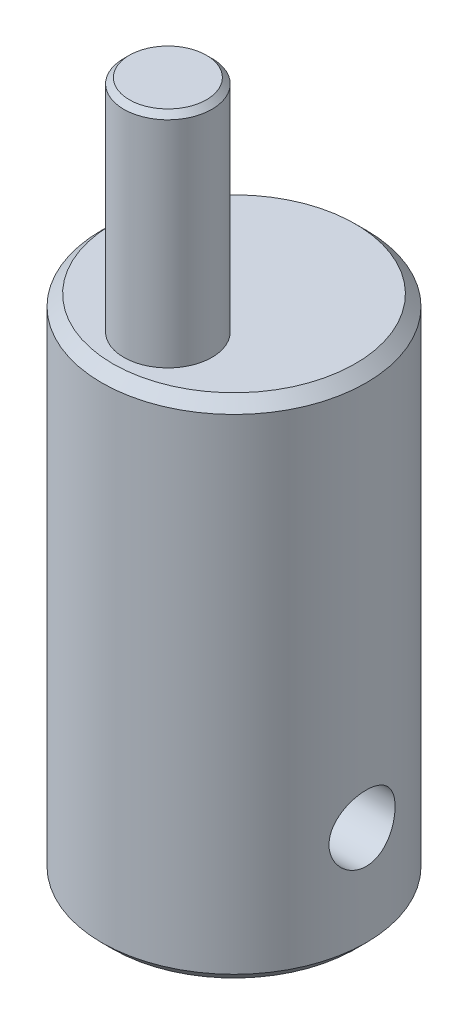
ISO-10303-21;
HEADER;
FILE_DESCRIPTION(('STEP AP214'),'2;1');
FILE_NAME('part.step','',(''),(''),'','','');
FILE_SCHEMA(('AUTOMOTIVE_DESIGN { 1 0 10303 214 1 1 1 1 }'));
ENDSEC;
DATA;
#1=APPLICATION_CONTEXT('core data for automotive mechanical design processes');
#2=APPLICATION_PROTOCOL_DEFINITION('international standard','automotive_design',2000,#1);
#3=PRODUCT_CONTEXT('',#1,'mechanical');
#4=PRODUCT('Part','Part','',(#3));
#5=PRODUCT_RELATED_PRODUCT_CATEGORY('part','',(#4));
#6=PRODUCT_DEFINITION_FORMATION('','',#4);
#7=PRODUCT_DEFINITION_CONTEXT('part definition',#1,'design');
#8=PRODUCT_DEFINITION('design','',#6,#7);
#9=PRODUCT_DEFINITION_SHAPE('','',#8);
#10=(LENGTH_UNIT() NAMED_UNIT(*) SI_UNIT(.MILLI.,.METRE.));
#11=(NAMED_UNIT(*) PLANE_ANGLE_UNIT() SI_UNIT($,.RADIAN.));
#12=(NAMED_UNIT(*) SI_UNIT($,.STERADIAN.) SOLID_ANGLE_UNIT());
#13=UNCERTAINTY_MEASURE_WITH_UNIT(LENGTH_MEASURE(1.E-05),#10,'distance_accuracy_value','');
#14=(GEOMETRIC_REPRESENTATION_CONTEXT(3) GLOBAL_UNCERTAINTY_ASSIGNED_CONTEXT((#13)) GLOBAL_UNIT_ASSIGNED_CONTEXT((#10,
#11,#12)) REPRESENTATION_CONTEXT('',''));
#15=CARTESIAN_POINT('',(0.,0.,0.));
#16=DIRECTION('',(0.,0.,1.));
#17=DIRECTION('',(1.,0.,0.));
#18=AXIS2_PLACEMENT_3D('',#15,#16,#17);
#19=CARTESIAN_POINT('',(0.,23.,0.));
#20=DIRECTION('',(0.,-1.,0.));
#21=DIRECTION('',(0.,0.,-1.));
#22=AXIS2_PLACEMENT_3D('',#19,#20,#21);
#23=CYLINDRICAL_SURFACE('',#22,6.);
#24=CARTESIAN_POINT('',(0.,0.499999999999994,0.));
#25=DIRECTION('',(0.,1.,0.));
#26=DIRECTION('',(0.,0.,1.));
#27=AXIS2_PLACEMENT_3D('',#24,#25,#26);
#28=CIRCLE('',#27,6.);
#29=CARTESIAN_POINT('',(0.,0.499999999999994,6.));
#30=VERTEX_POINT('',#29);
#31=EDGE_CURVE('E44',#30,#30,#28,.T.);
#32=ORIENTED_EDGE('',*,*,#31,.T.);
#33=EDGE_LOOP('',(#32));
#34=FACE_BOUND('',#33,.T.);
#35=CARTESIAN_POINT('',(0.,22.5,0.));
#36=DIRECTION('',(0.,1.,0.));
#37=DIRECTION('',(0.,0.,1.));
#38=AXIS2_PLACEMENT_3D('',#35,#36,#37);
#39=CIRCLE('',#38,6.);
#40=CARTESIAN_POINT('',(0.,22.5,6.));
#41=VERTEX_POINT('',#40);
#42=EDGE_CURVE('E48',#41,#41,#39,.F.);
#43=ORIENTED_EDGE('',*,*,#42,.T.);
#44=EDGE_LOOP('',(#43));
#45=FACE_BOUND('',#44,.T.);
#46=CARTESIAN_POINT('',(-6.,3.5,0.));
#47=CARTESIAN_POINT('',(-5.99999859868013,3.50000232573816,-0.0828760886697311));
#48=CARTESIAN_POINT('',(-5.99826578131828,3.50689155077379,-0.165778157830763));
#49=CARTESIAN_POINT('',(-5.99152113829892,3.534225151307,-0.329206323770533));
#50=CARTESIAN_POINT('',(-5.98650745419968,3.55467720953785,-0.409731046870739));
#51=CARTESIAN_POINT('',(-5.9737562633204,3.60843925346209,-0.566020872182577));
#52=CARTESIAN_POINT('',(-5.96602202842087,3.64173379871528,-0.641791563430003));
#53=CARTESIAN_POINT('',(-5.94865343807593,3.72018139004483,-0.786672131904427));
#54=CARTESIAN_POINT('',(-5.9390190185405,3.76533483611894,-0.855781784348759));
#55=CARTESIAN_POINT('',(-5.91867413591801,3.86720078965421,-0.98680192730092));
#56=CARTESIAN_POINT('',(-5.90794707148533,3.92411157495918,-1.04855569006107));
#57=CARTESIAN_POINT('',(-5.88673620117529,4.04745220490892,-1.1617489272033));
#58=CARTESIAN_POINT('',(-5.87625242288348,4.1138831229465,-1.21318723694913));
#59=CARTESIAN_POINT('',(-5.8565477569971,4.25559522673744,-1.30502654279903));
#60=CARTESIAN_POINT('',(-5.84734794470605,4.3309932308104,-1.34525221592536));
#61=CARTESIAN_POINT('',(-5.83149494812223,4.48774841165836,-1.41239690855053));
#62=CARTESIAN_POINT('',(-5.82484135672789,4.56910463332576,-1.43931805543933));
#63=CARTESIAN_POINT('',(-5.81500476717551,4.73374349820247,-1.47855483680429));
#64=CARTESIAN_POINT('',(-5.81175491075426,4.8169548960498,-1.49115226833334));
#65=CARTESIAN_POINT('',(-5.80889362537741,4.98436856901398,-1.50226177506785));
#66=CARTESIAN_POINT('',(-5.80928160448644,5.06857068069861,-1.50077614181798));
#67=CARTESIAN_POINT('',(-5.81359205496618,5.23341580774448,-1.48398652463928));
#68=CARTESIAN_POINT('',(-5.81742863001879,5.3140956214651,-1.46901834019052));
#69=CARTESIAN_POINT('',(-5.82806709676483,5.47176105091129,-1.42622418690311));
#70=CARTESIAN_POINT('',(-5.83486919970696,5.54874640302898,-1.39839730206942));
#71=CARTESIAN_POINT('',(-5.85075113904186,5.69773801625207,-1.33038947793715));
#72=CARTESIAN_POINT('',(-5.85985327469421,5.76968617178955,-1.29008666723291));
#73=CARTESIAN_POINT('',(-5.87929710846386,5.90591870975684,-1.19835627601495));
#74=CARTESIAN_POINT('',(-5.88963902334735,5.97020174806726,-1.14692674880884));
#75=CARTESIAN_POINT('',(-5.91075880539781,6.0912036156944,-1.03266342468122));
#76=CARTESIAN_POINT('',(-5.92154069477971,6.14765449006135,-0.96954625816586));
#77=CARTESIAN_POINT('',(-5.94205965578786,6.2492212424639,-0.8346119175037));
#78=CARTESIAN_POINT('',(-5.95179669549415,6.29433677426357,-0.762794477707944));
#79=CARTESIAN_POINT('',(-5.96917732094182,6.37205058622439,-0.612115888681392));
#80=CARTESIAN_POINT('',(-5.97681360127725,6.40460534025443,-0.533231393208624));
#81=CARTESIAN_POINT('',(-5.98907916991418,6.45591730570957,-0.370876008142883));
#82=CARTESIAN_POINT('',(-5.99370903339281,6.47467715641814,-0.287405999150485));
#83=CARTESIAN_POINT('',(-5.99935499271374,6.49745756555884,-0.120539970390027));
#84=CARTESIAN_POINT('',(-6.00046053508279,6.5018430260753,-0.0371967199882104));
#85=CARTESIAN_POINT('',(-5.99918804814451,6.49675099794451,0.129032874801507));
#86=CARTESIAN_POINT('',(-5.99681033241846,6.48727475720087,0.211919259644594));
#87=CARTESIAN_POINT('',(-5.98889581127357,6.45502909160862,0.373614268776491));
#88=CARTESIAN_POINT('',(-5.98340634185811,6.43245873652301,0.452465118968754));
#89=CARTESIAN_POINT('',(-5.96988706634134,6.37489291597155,0.605257292452511));
#90=CARTESIAN_POINT('',(-5.96185700369892,6.33989619568683,0.679198119032634));
#91=CARTESIAN_POINT('',(-5.9439330792631,6.25776387112527,0.821523134429847));
#92=CARTESIAN_POINT('',(-5.93400867366932,6.21042388760324,0.88978544183583));
#93=CARTESIAN_POINT('',(-5.91344509187419,6.10521009120303,1.01752661364325));
#94=CARTESIAN_POINT('',(-5.90280579251705,6.04733446038309,1.07700395897301));
#95=CARTESIAN_POINT('',(-5.88168956960771,5.92099803915554,1.18699056807273));
#96=CARTESIAN_POINT('',(-5.87122304187281,5.85231229699758,1.23724386762203));
#97=CARTESIAN_POINT('',(-5.85192878377239,5.70726736553428,1.3255107590127));
#98=CARTESIAN_POINT('',(-5.84310098067026,5.63090851704025,1.36352489415794));
#99=CARTESIAN_POINT('',(-5.82818094734665,5.47309427758692,1.42595142060929));
#100=CARTESIAN_POINT('',(-5.82207255291905,5.39167237165599,1.45044439665406));
#101=CARTESIAN_POINT('',(-5.81326744090183,5.22569036211089,1.48534565995378));
#102=CARTESIAN_POINT('',(-5.81056997719936,5.14113094896751,1.49575702747866));
#103=CARTESIAN_POINT('',(-5.80894901203957,4.9738789761448,1.50203859033399));
#104=CARTESIAN_POINT('',(-5.80991932728264,4.89120256487527,1.49831789778012));
#105=CARTESIAN_POINT('',(-5.81527909007843,4.72769611133202,1.47737727831287));
#106=CARTESIAN_POINT('',(-5.81966846891857,4.64686603198635,1.46015762268677));
#107=CARTESIAN_POINT('',(-5.83131260682722,4.48979154093459,1.41293131944279));
#108=CARTESIAN_POINT('',(-5.83855015236309,4.41352269475979,1.38300140468038));
#109=CARTESIAN_POINT('',(-5.85507755724828,4.26703461728631,1.31126491360507));
#110=CARTESIAN_POINT('',(-5.86436770120773,4.19681622681309,1.26945669003419));
#111=CARTESIAN_POINT('',(-5.88425634263512,4.06244537099798,1.17386774863714));
#112=CARTESIAN_POINT('',(-5.89488264831757,3.99849892657604,1.11980316291226));
#113=CARTESIAN_POINT('',(-5.91608027246286,3.88045295520459,1.00178937118974));
#114=CARTESIAN_POINT('',(-5.92665157727059,3.82635576988703,0.937837821261146));
#115=CARTESIAN_POINT('',(-5.94677655647663,3.72858869143539,0.800467586702591));
#116=CARTESIAN_POINT('',(-5.95630833365868,3.68512538632842,0.726898422316388));
#117=CARTESIAN_POINT('',(-5.97304924975118,3.61125253705947,0.573266059510477));
#118=CARTESIAN_POINT('',(-5.98026005199781,3.58083363935146,0.49320756343674));
#119=CARTESIAN_POINT('',(-5.99048059565541,3.53842816967035,0.344410253243472));
#120=CARTESIAN_POINT('',(-5.9940258505269,3.52404875694657,0.276380170908069));
#121=CARTESIAN_POINT('',(-5.99878605231948,3.50483405637806,0.138906071536283));
#122=CARTESIAN_POINT('',(-6.00000117450894,3.4999980506947,0.0694621612426164));
#123=CARTESIAN_POINT('',(-6.,3.5,0.));
#124=B_SPLINE_CURVE_WITH_KNOTS('',3,(#46,#47,#48,#49,#50,#51,#52,#53,#54,#55,#56,#57,#58,#59,
#60,#61,#62,#63,#64,#65,#66,#67,#68,#69,#70,#71,#72,#73,#74,#75,#76,#77,#78,#79,#80,#81,#82,#83,
#84,#85,#86,#87,#88,#89,#90,#91,#92,#93,#94,#95,#96,#97,#98,#99,#100,#101,#102,#103,#104,#105,
#106,#107,#108,#109,#110,#111,#112,#113,#114,#115,#116,#117,#118,#119,#120,#121,#122,#123),
.UNSPECIFIED.,.T.,.F.,(4,2,2,2,2,2,2,2,2,2,2,2,2,2,2,2,2,2,2,2,2,2,2,2,2,2,2,2,2,2,2,2,2,2,2,2,
2,2,4),(0.,0.24837371247189,0.4968882377639,0.745104902286106,0.993329940169329,
1.24614435437139,1.49898729580062,1.75558647545807,2.01214461169368,2.2635629509943,
2.51494038112697,2.76022497007018,3.00552703466038,3.25330527873879,3.50112690836163,
3.75601500969019,4.01091089558247,4.26668229009114,4.52240473688643,4.77158308949276,
5.02073901112743,5.26620274514037,5.5116912732229,5.76153587565352,6.01142363008019,
6.26744509204476,6.52345518749508,6.77792254614036,7.03233423252407,7.27943780398612,
7.52653640956034,7.77216400559447,8.01782568136901,8.2698957640991,8.52202569770417,
8.77872185499588,9.0352336382135,9.24342242942149,9.45159556043039),.UNSPECIFIED.);
#125=CARTESIAN_POINT('',(-6.,3.5,0.));
#126=VERTEX_POINT('',#125);
#127=EDGE_CURVE('E59',#126,#126,#124,.T.);
#128=ORIENTED_EDGE('',*,*,#127,.T.);
#129=EDGE_LOOP('',(#128));
#130=FACE_BOUND('',#129,.T.);
#131=CARTESIAN_POINT('',(5.80947501931112,5.,-1.5));
#132=CARTESIAN_POINT('',(5.80947660051185,4.91716954944523,-1.49999764715507));
#133=CARTESIAN_POINT('',(5.81126583608348,4.8343130607932,-1.49311574729838));
#134=CARTESIAN_POINT('',(5.81821117195949,4.67097945309558,-1.46581387527848));
#135=CARTESIAN_POINT('',(5.82336923173088,4.590503747319,-1.44538602404532));
#136=CARTESIAN_POINT('',(5.8364323475758,4.43431787708778,-1.39169471977917));
#137=CARTESIAN_POINT('',(5.84433385614245,4.3586017067686,-1.35844783671268));
#138=CARTESIAN_POINT('',(5.86198915217285,4.21381348847605,-1.28011268475685));
#139=CARTESIAN_POINT('',(5.87174301827101,4.14474172275186,-1.23502391313642));
#140=CARTESIAN_POINT('',(5.89224429813367,4.01368301284268,-1.13322505638712));
#141=CARTESIAN_POINT('',(5.90300758573818,3.95186383978997,-1.07630213262243));
#142=CARTESIAN_POINT('',(5.92417725309178,3.83854316338379,-0.952909238460398));
#143=CARTESIAN_POINT('',(5.93458359939834,3.78704262462695,-0.886438376508184));
#144=CARTESIAN_POINT('',(5.95404249312349,3.69513471942123,-0.744687120647372));
#145=CARTESIAN_POINT('',(5.96307412440355,3.65489216710312,-0.669296745717072));
#146=CARTESIAN_POINT('',(5.9785848715559,3.58771421350815,-0.512557910575657));
#147=CARTESIAN_POINT('',(5.98506436400607,3.56077684885069,-0.431210331475164));
#148=CARTESIAN_POINT('',(5.99462855308908,3.52151129925285,-0.266615255252496));
#149=CARTESIAN_POINT('',(5.99777936306588,3.50889821340405,-0.183439631729385));
#150=CARTESIAN_POINT('',(6.00056156464379,3.49774497243467,-0.016097291557661));
#151=CARTESIAN_POINT('',(6.00019347658022,3.49920273667424,0.0680692767228418));
#152=CARTESIAN_POINT('',(5.99602856972121,3.51594491015009,0.233028370758582));
#153=CARTESIAN_POINT('',(5.99230801404524,3.53092179503231,0.313854323401601));
#154=CARTESIAN_POINT('',(5.98194501914912,3.5737827620291,0.47180737112053));
#155=CARTESIAN_POINT('',(5.97530242439064,3.60166753122645,0.548934269055657));
#156=CARTESIAN_POINT('',(5.95972505820537,3.66980154241224,0.698110055252711));
#157=CARTESIAN_POINT('',(5.95077011817032,3.71016022679705,0.770106764649757));
#158=CARTESIAN_POINT('',(5.93153942285789,3.80201340746976,0.906413433510734));
#159=CARTESIAN_POINT('',(5.92126343791494,3.85350984113637,0.970722052628259));
#160=CARTESIAN_POINT('',(5.90018228261712,3.96782524518943,1.09166105262743));
#161=CARTESIAN_POINT('',(5.88937031715551,4.03091293540867,1.1480365186128));
#162=CARTESIAN_POINT('',(5.86869026110024,4.16575998412415,1.24946456394453));
#163=CARTESIAN_POINT('',(5.85882221463582,4.2375197476946,1.29451661406903));
#164=CARTESIAN_POINT('',(5.84112298098989,4.38817402048938,1.3721821935339));
#165=CARTESIAN_POINT('',(5.83330190235432,4.46710143818792,1.40473435045574));
#166=CARTESIAN_POINT('',(5.82071184083974,4.62955128084587,1.45602843095451));
#167=CARTESIAN_POINT('',(5.81594220486131,4.71307271838988,1.47477330982937));
#168=CARTESIAN_POINT('',(5.81013213623484,4.87997570091387,1.49749778319911));
#169=CARTESIAN_POINT('',(5.80899653456189,4.96330267599778,1.50185428435178));
#170=CARTESIAN_POINT('',(5.81032406088624,5.1294931619469,1.49671019430933));
#171=CARTESIAN_POINT('',(5.8127868576076,5.21235671477075,1.48721087870928));
#172=CARTESIAN_POINT('',(5.82094249172736,5.37386855897283,1.4549552783626));
#173=CARTESIAN_POINT('',(5.82658182140625,5.45256363594251,1.43241844096905));
#174=CARTESIAN_POINT('',(5.84040430962577,5.60505887471101,1.37497084900237));
#175=CARTESIAN_POINT('',(5.84858776949168,5.6788584554332,1.34005862862753));
#176=CARTESIAN_POINT('',(5.86677682255957,5.82106476672041,1.25806240076193));
#177=CARTESIAN_POINT('',(5.87681501163985,5.88933730402586,1.21075305230138));
#178=CARTESIAN_POINT('',(5.89750249843029,6.01711301768081,1.10559043940168));
#179=CARTESIAN_POINT('',(5.90815189637082,6.07661474999005,1.04773544220816));
#180=CARTESIAN_POINT('',(5.92918441818964,6.18668662554257,0.921394081477088));
#181=CARTESIAN_POINT('',(5.93955421237101,6.23699603752929,0.852677928797388));
#182=CARTESIAN_POINT('',(5.9585832996824,6.32536152017075,0.707554024042012));
#183=CARTESIAN_POINT('',(5.96724268202376,6.36341822996492,0.631146673436386));
#184=CARTESIAN_POINT('',(5.98182069442988,6.42586762071676,0.473337302596635));
#185=CARTESIAN_POINT('',(5.98775898013446,6.45035857062744,0.391976071541821));
#186=CARTESIAN_POINT('',(5.99631176037473,6.48527620076505,0.226124640478211));
#187=CARTESIAN_POINT('',(5.99892689636045,6.49570559524343,0.141635047561864));
#188=CARTESIAN_POINT('',(6.00051254113217,6.5020513843633,-0.0256252896649907));
#189=CARTESIAN_POINT('',(5.99957968320012,6.49835256364309,-0.108380740449051));
#190=CARTESIAN_POINT('',(5.99438844686135,6.4774282590585,-0.27205124462211));
#191=CARTESIAN_POINT('',(5.99013016735643,6.46020317748035,-0.352966352671331));
#192=CARTESIAN_POINT('',(5.97878149280944,6.41292167034361,-0.510256553467225));
#193=CARTESIAN_POINT('',(5.97170646753999,6.38293482002806,-0.586653741871529));
#194=CARTESIAN_POINT('',(5.95546933370076,6.31104413147101,-0.733375579562203));
#195=CARTESIAN_POINT('',(5.94630696206604,6.26913879099565,-0.803699461897578));
#196=CARTESIAN_POINT('',(5.92660874521999,6.17342714900439,-0.93810289263585));
#197=CARTESIAN_POINT('',(5.91604525418417,6.11935978563893,-1.00199248245088));
#198=CARTESIAN_POINT('',(5.89485973579863,6.0013657220393,-1.11992253040688));
#199=CARTESIAN_POINT('',(5.88423769428834,5.93743652585314,-1.17396048760228));
#200=CARTESIAN_POINT('',(5.86391213790822,5.800097878698,-1.27164303971884));
#201=CARTESIAN_POINT('',(5.85422945594827,5.72653381488106,-1.31507492916982));
#202=CARTESIAN_POINT('',(5.83715933325923,5.57291676511595,-1.3888903449235));
#203=CARTESIAN_POINT('',(5.82977022370054,5.49286855083989,-1.41928336463958));
#204=CARTESIAN_POINT('',(5.81927863109675,5.34413448225992,-1.46163379284816));
#205=CARTESIAN_POINT('',(5.8156299450082,5.27616025342421,-1.47598975589307));
#206=CARTESIAN_POINT('',(5.81072757878358,5.13879669650005,-1.4951734388599));
#207=CARTESIAN_POINT('',(5.80947369434945,5.06940748963241,-1.50000197155828));
#208=CARTESIAN_POINT('',(5.80947501931112,5.,-1.5));
#209=B_SPLINE_CURVE_WITH_KNOTS('',3,(#131,#132,#133,#134,#135,#136,#137,#138,#139,#140,#141,
#142,#143,#144,#145,#146,#147,#148,#149,#150,#151,#152,#153,#154,#155,#156,#157,#158,#159,#160,
#161,#162,#163,#164,#165,#166,#167,#168,#169,#170,#171,#172,#173,#174,#175,#176,#177,#178,#179,
#180,#181,#182,#183,#184,#185,#186,#187,#188,#189,#190,#191,#192,#193,#194,#195,#196,#197,#198,
#199,#200,#201,#202,#203,#204,#205,#206,#207,#208),.UNSPECIFIED.,.T.,.F.,(4,2,2,2,2,2,2,2,2,2,2,
2,2,2,2,2,2,2,2,2,2,2,2,2,2,2,2,2,2,2,2,2,2,2,2,2,2,2,4),(0.,0.248236465041681,0.4966174448572,
0.744678436299613,0.992749960532871,1.24574372515786,1.4987611288792,1.75530897838752,
2.01181895908255,2.26313250597208,2.51440889199612,2.76010957613368,3.00582334034872,
3.25375724552667,3.50173431281348,3.75642279943147,4.01112318719881,4.26705859205042,
4.52293920077729,4.7720614485703,5.02116076310281,5.26618443005524,5.51123712852851,
5.76109707515495,6.01099811331027,6.26715198579191,6.52329249431732,6.77755243684158,
7.03176329345423,7.27910067676474,7.52643070426189,7.77242925935826,8.01845883442843,
8.27038257949243,8.52237018939305,8.77905886370806,9.03556032819972,9.24358696306398,
9.45159585059712),.UNSPECIFIED.);
#210=CARTESIAN_POINT('',(5.80947501931112,5.,-1.5));
#211=VERTEX_POINT('',#210);
#212=EDGE_CURVE('E67',#211,#211,#209,.T.);
#213=ORIENTED_EDGE('',*,*,#212,.T.);
#214=EDGE_LOOP('',(#213));
#215=FACE_BOUND('',#214,.T.);
#216=ADVANCED_FACE('F32',(#34,#45,#130,#215),#23,.T.);
#217=CARTESIAN_POINT('',(0.,23.,0.));
#218=DIRECTION('',(0.,1.,0.));
#219=DIRECTION('',(0.,0.,1.));
#220=AXIS2_PLACEMENT_3D('',#217,#218,#219);
#221=PLANE('',#220);
#222=CARTESIAN_POINT('',(0.,23.,0.));
#223=DIRECTION('',(0.,1.,0.));
#224=DIRECTION('',(0.,0.,1.));
#225=AXIS2_PLACEMENT_3D('',#222,#223,#224);
#226=CIRCLE('',#225,5.50000000000001);
#227=CARTESIAN_POINT('',(0.,23.,5.50000000000001));
#228=VERTEX_POINT('',#227);
#229=EDGE_CURVE('E10',#228,#228,#226,.T.);
#230=ORIENTED_EDGE('',*,*,#229,.T.);
#231=EDGE_LOOP('',(#230));
#232=FACE_BOUND('',#231,.T.);
#233=CARTESIAN_POINT('',(0.,23.,3.));
#234=DIRECTION('',(0.,1.,0.));
#235=DIRECTION('',(0.,0.,1.));
#236=AXIS2_PLACEMENT_3D('',#233,#234,#235);
#237=CIRCLE('',#236,2.);
#238=CARTESIAN_POINT('',(0.,23.,5.));
#239=VERTEX_POINT('',#238);
#240=EDGE_CURVE('E108',#239,#239,#237,.T.);
#241=ORIENTED_EDGE('',*,*,#240,.F.);
#242=EDGE_LOOP('',(#241));
#243=FACE_BOUND('',#242,.T.);
#244=ADVANCED_FACE('F91',(#232,#243),#221,.T.);
#245=CARTESIAN_POINT('',(0.,0.,0.));
#246=DIRECTION('',(0.,1.,0.));
#247=DIRECTION('',(0.,0.,1.));
#248=AXIS2_PLACEMENT_3D('',#245,#246,#247);
#249=PLANE('',#248);
#250=CARTESIAN_POINT('',(0.,0.,0.));
#251=DIRECTION('',(0.,1.,0.));
#252=DIRECTION('',(0.,0.,1.));
#253=AXIS2_PLACEMENT_3D('',#250,#251,#252);
#254=CIRCLE('',#253,5.5);
#255=CARTESIAN_POINT('',(0.,0.,5.5));
#256=VERTEX_POINT('',#255);
#257=EDGE_CURVE('E40',#256,#256,#254,.F.);
#258=ORIENTED_EDGE('',*,*,#257,.T.);
#259=EDGE_LOOP('',(#258));
#260=FACE_BOUND('',#259,.T.);
#261=ADVANCED_FACE('F89',(#260),#249,.F.);
#262=CARTESIAN_POINT('',(0.,33.,3.));
#263=DIRECTION('',(0.,-1.,0.));
#264=DIRECTION('',(0.,0.,-1.));
#265=AXIS2_PLACEMENT_3D('',#262,#263,#264);
#266=CYLINDRICAL_SURFACE('',#265,2.);
#267=CARTESIAN_POINT('',(0.,32.75,3.));
#268=DIRECTION('',(0.,1.,0.));
#269=DIRECTION('',(0.,0.,1.));
#270=AXIS2_PLACEMENT_3D('',#267,#268,#269);
#271=CIRCLE('',#270,2.);
#272=CARTESIAN_POINT('',(0.,32.75,5.));
#273=VERTEX_POINT('',#272);
#274=EDGE_CURVE('E53',#273,#273,#271,.F.);
#275=ORIENTED_EDGE('',*,*,#274,.T.);
#276=EDGE_LOOP('',(#275));
#277=FACE_BOUND('',#276,.T.);
#278=ORIENTED_EDGE('',*,*,#240,.T.);
#279=EDGE_LOOP('',(#278));
#280=FACE_BOUND('',#279,.T.);
#281=ADVANCED_FACE('F85',(#277,#280),#266,.T.);
#282=CARTESIAN_POINT('',(0.,33.,3.));
#283=DIRECTION('',(0.,1.,0.));
#284=DIRECTION('',(0.,0.,1.));
#285=AXIS2_PLACEMENT_3D('',#282,#283,#284);
#286=PLANE('',#285);
#287=CARTESIAN_POINT('',(0.,33.,3.));
#288=DIRECTION('',(0.,1.,0.));
#289=DIRECTION('',(0.,0.,1.));
#290=AXIS2_PLACEMENT_3D('',#287,#288,#289);
#291=CIRCLE('',#290,1.75000000000001);
#292=CARTESIAN_POINT('',(0.,33.,4.75000000000001));
#293=VERTEX_POINT('',#292);
#294=EDGE_CURVE('E56',#293,#293,#291,.T.);
#295=ORIENTED_EDGE('',*,*,#294,.T.);
#296=EDGE_LOOP('',(#295));
#297=FACE_BOUND('',#296,.T.);
#298=ADVANCED_FACE('F80',(#297),#286,.T.);
#299=CARTESIAN_POINT('',(-6.,5.,0.));
#300=DIRECTION('',(1.,0.,0.));
#301=DIRECTION('',(0.,0.,-1.));
#302=AXIS2_PLACEMENT_3D('',#299,#300,#301);
#303=CYLINDRICAL_SURFACE('',#302,1.5);
#304=ORIENTED_EDGE('',*,*,#212,.F.);
#305=EDGE_LOOP('',(#304));
#306=FACE_BOUND('',#305,.T.);
#307=ORIENTED_EDGE('',*,*,#127,.F.);
#308=EDGE_LOOP('',(#307));
#309=FACE_BOUND('',#308,.T.);
#310=ADVANCED_FACE('F75',(#306,#309),#303,.F.);
#311=CARTESIAN_POINT('',(0.,33.,3.));
#312=DIRECTION('',(0.,-1.,0.));
#313=DIRECTION('',(0.,0.,-1.));
#314=AXIS2_PLACEMENT_3D('',#311,#312,#313);
#315=CONICAL_SURFACE('',#314,1.75000000000001,0.785398163397438);
#316=ORIENTED_EDGE('',*,*,#274,.F.);
#317=EDGE_LOOP('',(#316));
#318=FACE_BOUND('',#317,.T.);
#319=ORIENTED_EDGE('',*,*,#294,.F.);
#320=EDGE_LOOP('',(#319));
#321=FACE_BOUND('',#320,.T.);
#322=ADVANCED_FACE('F79',(#318,#321),#315,.T.);
#323=CARTESIAN_POINT('',(0.,0.499999999999994,0.));
#324=DIRECTION('',(0.,1.,0.));
#325=DIRECTION('',(0.,0.,1.));
#326=AXIS2_PLACEMENT_3D('',#323,#324,#325);
#327=CONICAL_SURFACE('',#326,6.,0.785398163397453);
#328=ORIENTED_EDGE('',*,*,#257,.F.);
#329=EDGE_LOOP('',(#328));
#330=FACE_BOUND('',#329,.T.);
#331=ORIENTED_EDGE('',*,*,#31,.F.);
#332=EDGE_LOOP('',(#331));
#333=FACE_BOUND('',#332,.T.);
#334=ADVANCED_FACE('F117',(#330,#333),#327,.T.);
#335=CARTESIAN_POINT('',(0.,23.,0.));
#336=DIRECTION('',(0.,-1.,0.));
#337=DIRECTION('',(0.,0.,-1.));
#338=AXIS2_PLACEMENT_3D('',#335,#336,#337);
#339=CONICAL_SURFACE('',#338,5.50000000000001,0.785398163397446);
#340=ORIENTED_EDGE('',*,*,#42,.F.);
#341=EDGE_LOOP('',(#340));
#342=FACE_BOUND('',#341,.T.);
#343=ORIENTED_EDGE('',*,*,#229,.F.);
#344=EDGE_LOOP('',(#343));
#345=FACE_BOUND('',#344,.T.);
#346=ADVANCED_FACE('F35',(#342,#345),#339,.T.);
#347=CLOSED_SHELL('',(#216,#244,#261,#281,#298,#310,#322,#334,#346));
#348=MANIFOLD_SOLID_BREP('B2',#347);
#349=ADVANCED_BREP_SHAPE_REPRESENTATION('',(#18,#348),#14);
#350=SHAPE_DEFINITION_REPRESENTATION(#9,#349);
ENDSEC;
END-ISO-10303-21;
